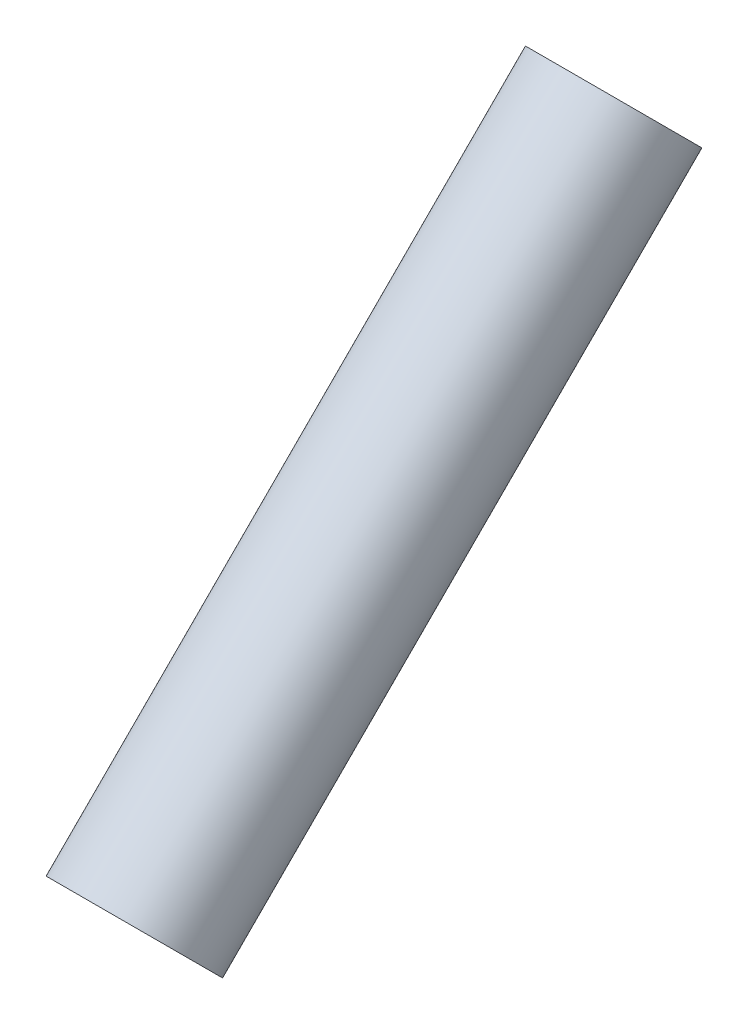
ISO-10303-21;
HEADER;
FILE_DESCRIPTION(('STEP AP214'),'2;1');
FILE_NAME('part.step','',(''),(''),'','','');
FILE_SCHEMA(('AUTOMOTIVE_DESIGN { 1 0 10303 214 1 1 1 1 }'));
ENDSEC;
DATA;
#1=APPLICATION_CONTEXT('core data for automotive mechanical design processes');
#2=APPLICATION_PROTOCOL_DEFINITION('international standard','automotive_design',2000,#1);
#3=PRODUCT_CONTEXT('',#1,'mechanical');
#4=PRODUCT('Part','Part','',(#3));
#5=PRODUCT_RELATED_PRODUCT_CATEGORY('part','',(#4));
#6=PRODUCT_DEFINITION_FORMATION('','',#4);
#7=PRODUCT_DEFINITION_CONTEXT('part definition',#1,'design');
#8=PRODUCT_DEFINITION('design','',#6,#7);
#9=PRODUCT_DEFINITION_SHAPE('','',#8);
#10=(LENGTH_UNIT() NAMED_UNIT(*) SI_UNIT(.MILLI.,.METRE.));
#11=(NAMED_UNIT(*) PLANE_ANGLE_UNIT() SI_UNIT($,.RADIAN.));
#12=(NAMED_UNIT(*) SI_UNIT($,.STERADIAN.) SOLID_ANGLE_UNIT());
#13=UNCERTAINTY_MEASURE_WITH_UNIT(LENGTH_MEASURE(1.E-05),#10,'distance_accuracy_value','');
#14=(GEOMETRIC_REPRESENTATION_CONTEXT(3) GLOBAL_UNCERTAINTY_ASSIGNED_CONTEXT((#13)) GLOBAL_UNIT_ASSIGNED_CONTEXT((#10,
#11,#12)) REPRESENTATION_CONTEXT('',''));
#15=CARTESIAN_POINT('',(0.,0.,0.));
#16=DIRECTION('',(0.,0.,1.));
#17=DIRECTION('',(1.,0.,0.));
#18=AXIS2_PLACEMENT_3D('',#15,#16,#17);
#19=CARTESIAN_POINT('',(0.,-117.202948981674,117.202948981668));
#20=DIRECTION('',(0.,-0.707106781186543,0.707106781186552));
#21=DIRECTION('',(0.,-0.707106781186552,-0.707106781186543));
#22=AXIS2_PLACEMENT_3D('',#19,#20,#21);
#23=PLANE('',#22);
#24=CARTESIAN_POINT('',(0.,59.5737463149675,293.979644278308));
#25=DIRECTION('',(0.,0.707106781186543,-0.707106781186552));
#26=DIRECTION('',(0.,0.707106781186552,0.707106781186543));
#27=AXIS2_PLACEMENT_3D('',#24,#25,#26);
#28=CIRCLE('',#27,12.9999999999991);
#29=CARTESIAN_POINT('',(0.,68.7661344703921,303.172032433732));
#30=VERTEX_POINT('',#29);
#31=EDGE_CURVE('E10',#30,#30,#28,.T.);
#32=ORIENTED_EDGE('',*,*,#31,.T.);
#33=EDGE_LOOP('',(#32));
#34=FACE_BOUND('',#33,.T.);
#35=CARTESIAN_POINT('',(0.,59.5737463149675,293.979644278308));
#36=DIRECTION('',(0.,0.707106781186543,-0.707106781186552));
#37=DIRECTION('',(0.,0.707106781186552,0.707106781186543));
#38=AXIS2_PLACEMENT_3D('',#35,#36,#37);
#39=CIRCLE('',#38,14.9999999999991);
#40=CARTESIAN_POINT('',(0.,70.1803480327652,304.586245996105));
#41=VERTEX_POINT('',#40);
#42=EDGE_CURVE('E47',#41,#41,#39,.T.);
#43=ORIENTED_EDGE('',*,*,#42,.F.);
#44=EDGE_LOOP('',(#43));
#45=FACE_BOUND('',#44,.T.);
#46=ADVANCED_FACE('F33',(#34,#45),#23,.T.);
#47=CARTESIAN_POINT('',(0.,176.776695296637,176.776695296637));
#48=DIRECTION('',(0.,0.707106781186543,-0.707106781186552));
#49=DIRECTION('',(0.,0.707106781186552,0.707106781186543));
#50=AXIS2_PLACEMENT_3D('',#47,#48,#49);
#51=CYLINDRICAL_SURFACE('',#50,12.9999999999996);
#52=CARTESIAN_POINT('',(0.,159.331782032355,194.221608560918));
#53=DIRECTION('',(0.,0.707106781186543,-0.707106781186552));
#54=DIRECTION('',(0.,0.707106781186552,0.707106781186543));
#55=AXIS2_PLACEMENT_3D('',#52,#53,#54);
#56=CIRCLE('',#55,13.0000000000001);
#57=CARTESIAN_POINT('',(0.,168.524170187781,203.413996716343));
#58=VERTEX_POINT('',#57);
#59=EDGE_CURVE('E39',#58,#58,#56,.T.);
#60=ORIENTED_EDGE('',*,*,#59,.T.);
#61=EDGE_LOOP('',(#60));
#62=FACE_BOUND('',#61,.T.);
#63=ORIENTED_EDGE('',*,*,#31,.F.);
#64=EDGE_LOOP('',(#63));
#65=FACE_BOUND('',#64,.T.);
#66=ADVANCED_FACE('F57',(#62,#65),#51,.F.);
#67=CARTESIAN_POINT('',(0.,-17.4449132642823,17.4449132642826));
#68=DIRECTION('',(0.,0.707106781186543,-0.707106781186552));
#69=DIRECTION('',(0.,0.707106781186552,0.707106781186543));
#70=AXIS2_PLACEMENT_3D('',#67,#68,#69);
#71=PLANE('',#70);
#72=CARTESIAN_POINT('',(0.,159.331782032356,194.221608560918));
#73=DIRECTION('',(0.,0.707106781186543,-0.707106781186552));
#74=DIRECTION('',(0.,0.707106781186552,0.707106781186543));
#75=AXIS2_PLACEMENT_3D('',#72,#73,#74);
#76=CIRCLE('',#75,14.9999999999999);
#77=CARTESIAN_POINT('',(0.,169.938383750154,204.828210278716));
#78=VERTEX_POINT('',#77);
#79=EDGE_CURVE('E43',#78,#78,#76,.T.);
#80=ORIENTED_EDGE('',*,*,#79,.T.);
#81=EDGE_LOOP('',(#80));
#82=FACE_BOUND('',#81,.T.);
#83=ORIENTED_EDGE('',*,*,#59,.F.);
#84=EDGE_LOOP('',(#83));
#85=FACE_BOUND('',#84,.T.);
#86=ADVANCED_FACE('F61',(#82,#85),#71,.T.);
#87=CARTESIAN_POINT('',(0.,176.776695296637,176.776695296637));
#88=DIRECTION('',(0.,0.707106781186543,-0.707106781186552));
#89=DIRECTION('',(0.,0.707106781186552,0.707106781186543));
#90=AXIS2_PLACEMENT_3D('',#87,#88,#89);
#91=CYLINDRICAL_SURFACE('',#90,14.9999999999995);
#92=ORIENTED_EDGE('',*,*,#42,.T.);
#93=EDGE_LOOP('',(#92));
#94=FACE_BOUND('',#93,.T.);
#95=ORIENTED_EDGE('',*,*,#79,.F.);
#96=EDGE_LOOP('',(#95));
#97=FACE_BOUND('',#96,.T.);
#98=ADVANCED_FACE('F53',(#94,#97),#91,.T.);
#99=CLOSED_SHELL('',(#46,#66,#86,#98));
#100=MANIFOLD_SOLID_BREP('B2',#99);
#101=ADVANCED_BREP_SHAPE_REPRESENTATION('',(#18,#100),#14);
#102=SHAPE_DEFINITION_REPRESENTATION(#9,#101);
ENDSEC;
END-ISO-10303-21;
